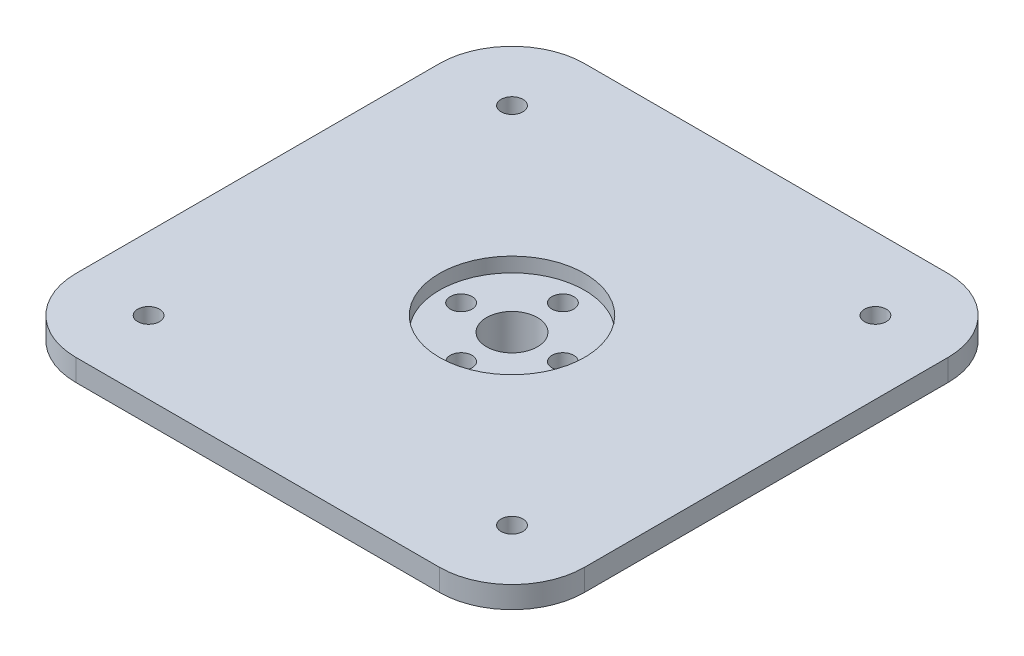
ISO-10303-21;
HEADER;
FILE_DESCRIPTION(('STEP AP214'),'2;1');
FILE_NAME('part.step','',(''),(''),'','','');
FILE_SCHEMA(('AUTOMOTIVE_DESIGN { 1 0 10303 214 1 1 1 1 }'));
ENDSEC;
DATA;
#1=APPLICATION_CONTEXT('core data for automotive mechanical design processes');
#2=APPLICATION_PROTOCOL_DEFINITION('international standard','automotive_design',2000,#1);
#3=PRODUCT_CONTEXT('',#1,'mechanical');
#4=PRODUCT('Part','Part','',(#3));
#5=PRODUCT_RELATED_PRODUCT_CATEGORY('part','',(#4));
#6=PRODUCT_DEFINITION_FORMATION('','',#4);
#7=PRODUCT_DEFINITION_CONTEXT('part definition',#1,'design');
#8=PRODUCT_DEFINITION('design','',#6,#7);
#9=PRODUCT_DEFINITION_SHAPE('','',#8);
#10=(LENGTH_UNIT() NAMED_UNIT(*) SI_UNIT(.MILLI.,.METRE.));
#11=(NAMED_UNIT(*) PLANE_ANGLE_UNIT() SI_UNIT($,.RADIAN.));
#12=(NAMED_UNIT(*) SI_UNIT($,.STERADIAN.) SOLID_ANGLE_UNIT());
#13=UNCERTAINTY_MEASURE_WITH_UNIT(LENGTH_MEASURE(1.E-05),#10,'distance_accuracy_value','');
#14=(GEOMETRIC_REPRESENTATION_CONTEXT(3) GLOBAL_UNCERTAINTY_ASSIGNED_CONTEXT((#13)) GLOBAL_UNIT_ASSIGNED_CONTEXT((#10,
#11,#12)) REPRESENTATION_CONTEXT('',''));
#15=CARTESIAN_POINT('',(0.,0.,0.));
#16=DIRECTION('',(0.,0.,1.));
#17=DIRECTION('',(1.,0.,0.));
#18=AXIS2_PLACEMENT_3D('',#15,#16,#17);
#19=CARTESIAN_POINT('',(0.,3.,-7.));
#20=DIRECTION('',(0.,-1.,0.));
#21=DIRECTION('',(0.,0.,-1.));
#22=AXIS2_PLACEMENT_3D('',#19,#20,#21);
#23=CYLINDRICAL_SURFACE('',#22,1.5);
#24=CARTESIAN_POINT('',(0.,-7.,-7.));
#25=DIRECTION('',(0.,-1.,0.));
#26=DIRECTION('',(0.,0.,-1.));
#27=AXIS2_PLACEMENT_3D('',#24,#25,#26);
#28=CIRCLE('',#27,1.5);
#29=CARTESIAN_POINT('',(0.,-7.,-8.5));
#30=VERTEX_POINT('',#29);
#31=EDGE_CURVE('E222',#30,#30,#28,.F.);
#32=ORIENTED_EDGE('',*,*,#31,.F.);
#33=EDGE_LOOP('',(#32));
#34=FACE_BOUND('',#33,.T.);
#35=CARTESIAN_POINT('',(0.,1.,-7.));
#36=DIRECTION('',(0.,1.,0.));
#37=DIRECTION('',(0.,0.,1.));
#38=AXIS2_PLACEMENT_3D('',#35,#36,#37);
#39=CIRCLE('',#38,1.5);
#40=CARTESIAN_POINT('',(0.,1.,-5.5));
#41=VERTEX_POINT('',#40);
#42=EDGE_CURVE('E245',#41,#41,#39,.T.);
#43=ORIENTED_EDGE('',*,*,#42,.T.);
#44=EDGE_LOOP('',(#43));
#45=FACE_BOUND('',#44,.T.);
#46=ADVANCED_FACE('F45',(#34,#45),#23,.F.);
#47=CARTESIAN_POINT('',(7.,3.,0.));
#48=DIRECTION('',(0.,-1.,0.));
#49=DIRECTION('',(0.,0.,-1.));
#50=AXIS2_PLACEMENT_3D('',#47,#48,#49);
#51=CYLINDRICAL_SURFACE('',#50,1.5);
#52=CARTESIAN_POINT('',(7.,-7.,0.));
#53=DIRECTION('',(0.,-1.,0.));
#54=DIRECTION('',(0.,0.,-1.));
#55=AXIS2_PLACEMENT_3D('',#52,#53,#54);
#56=CIRCLE('',#55,1.5);
#57=CARTESIAN_POINT('',(7.,-7.,-1.5));
#58=VERTEX_POINT('',#57);
#59=EDGE_CURVE('E217',#58,#58,#56,.F.);
#60=ORIENTED_EDGE('',*,*,#59,.F.);
#61=EDGE_LOOP('',(#60));
#62=FACE_BOUND('',#61,.T.);
#63=CARTESIAN_POINT('',(7.,1.,0.));
#64=DIRECTION('',(0.,1.,0.));
#65=DIRECTION('',(0.,0.,1.));
#66=AXIS2_PLACEMENT_3D('',#63,#64,#65);
#67=CIRCLE('',#66,1.5);
#68=CARTESIAN_POINT('',(7.,1.,1.5));
#69=VERTEX_POINT('',#68);
#70=EDGE_CURVE('E250',#69,#69,#67,.T.);
#71=ORIENTED_EDGE('',*,*,#70,.T.);
#72=EDGE_LOOP('',(#71));
#73=FACE_BOUND('',#72,.T.);
#74=ADVANCED_FACE('F284',(#62,#73),#51,.F.);
#75=CARTESIAN_POINT('',(0.,3.,0.));
#76=DIRECTION('',(0.,-1.,0.));
#77=DIRECTION('',(0.,0.,-1.));
#78=AXIS2_PLACEMENT_3D('',#75,#76,#77);
#79=CYLINDRICAL_SURFACE('',#78,3.5);
#80=CARTESIAN_POINT('',(0.,-7.,0.));
#81=DIRECTION('',(0.,-1.,0.));
#82=DIRECTION('',(0.,0.,-1.));
#83=AXIS2_PLACEMENT_3D('',#80,#81,#82);
#84=CIRCLE('',#83,3.5);
#85=CARTESIAN_POINT('',(0.,-7.,-3.50000000000001));
#86=VERTEX_POINT('',#85);
#87=EDGE_CURVE('E228',#86,#86,#84,.F.);
#88=ORIENTED_EDGE('',*,*,#87,.F.);
#89=EDGE_LOOP('',(#88));
#90=FACE_BOUND('',#89,.T.);
#91=CARTESIAN_POINT('',(0.,1.,0.));
#92=DIRECTION('',(0.,1.,0.));
#93=DIRECTION('',(0.,0.,1.));
#94=AXIS2_PLACEMENT_3D('',#91,#92,#93);
#95=CIRCLE('',#94,3.5);
#96=CARTESIAN_POINT('',(0.,1.,3.5));
#97=VERTEX_POINT('',#96);
#98=EDGE_CURVE('E253',#97,#97,#95,.T.);
#99=ORIENTED_EDGE('',*,*,#98,.T.);
#100=EDGE_LOOP('',(#99));
#101=FACE_BOUND('',#100,.T.);
#102=ADVANCED_FACE('F291',(#90,#101),#79,.F.);
#103=CARTESIAN_POINT('',(0.,3.,7.));
#104=DIRECTION('',(0.,-1.,0.));
#105=DIRECTION('',(0.,0.,-1.));
#106=AXIS2_PLACEMENT_3D('',#103,#104,#105);
#107=CYLINDRICAL_SURFACE('',#106,1.5);
#108=CARTESIAN_POINT('',(0.,-7.,7.));
#109=DIRECTION('',(0.,-1.,0.));
#110=DIRECTION('',(0.,0.,-1.));
#111=AXIS2_PLACEMENT_3D('',#108,#109,#110);
#112=CIRCLE('',#111,1.5);
#113=CARTESIAN_POINT('',(0.,-7.,5.5));
#114=VERTEX_POINT('',#113);
#115=EDGE_CURVE('E231',#114,#114,#112,.F.);
#116=ORIENTED_EDGE('',*,*,#115,.F.);
#117=EDGE_LOOP('',(#116));
#118=FACE_BOUND('',#117,.T.);
#119=CARTESIAN_POINT('',(0.,1.,7.));
#120=DIRECTION('',(0.,1.,0.));
#121=DIRECTION('',(0.,0.,1.));
#122=AXIS2_PLACEMENT_3D('',#119,#120,#121);
#123=CIRCLE('',#122,1.5);
#124=CARTESIAN_POINT('',(0.,1.,8.5));
#125=VERTEX_POINT('',#124);
#126=EDGE_CURVE('E256',#125,#125,#123,.T.);
#127=ORIENTED_EDGE('',*,*,#126,.T.);
#128=EDGE_LOOP('',(#127));
#129=FACE_BOUND('',#128,.T.);
#130=ADVANCED_FACE('F364',(#118,#129),#107,.F.);
#131=CARTESIAN_POINT('',(-7.,3.,0.));
#132=DIRECTION('',(0.,-1.,0.));
#133=DIRECTION('',(0.,0.,-1.));
#134=AXIS2_PLACEMENT_3D('',#131,#132,#133);
#135=CYLINDRICAL_SURFACE('',#134,1.5);
#136=CARTESIAN_POINT('',(-7.,-7.,0.));
#137=DIRECTION('',(0.,-1.,0.));
#138=DIRECTION('',(0.,0.,-1.));
#139=AXIS2_PLACEMENT_3D('',#136,#137,#138);
#140=CIRCLE('',#139,1.5);
#141=CARTESIAN_POINT('',(-7.,-7.,-1.5));
#142=VERTEX_POINT('',#141);
#143=EDGE_CURVE('E225',#142,#142,#140,.F.);
#144=ORIENTED_EDGE('',*,*,#143,.F.);
#145=EDGE_LOOP('',(#144));
#146=FACE_BOUND('',#145,.T.);
#147=CARTESIAN_POINT('',(-7.,1.,0.));
#148=DIRECTION('',(0.,1.,0.));
#149=DIRECTION('',(0.,0.,1.));
#150=AXIS2_PLACEMENT_3D('',#147,#148,#149);
#151=CIRCLE('',#150,1.5);
#152=CARTESIAN_POINT('',(-7.,1.,1.5));
#153=VERTEX_POINT('',#152);
#154=EDGE_CURVE('E49',#153,#153,#151,.T.);
#155=ORIENTED_EDGE('',*,*,#154,.T.);
#156=EDGE_LOOP('',(#155));
#157=FACE_BOUND('',#156,.T.);
#158=ADVANCED_FACE('F269',(#146,#157),#135,.F.);
#159=CARTESIAN_POINT('',(0.,0.,0.));
#160=DIRECTION('',(0.,-1.,0.));
#161=DIRECTION('',(0.,0.,-1.));
#162=AXIS2_PLACEMENT_3D('',#159,#160,#161);
#163=PLANE('',#162);
#164=CARTESIAN_POINT('',(0.,0.,0.));
#165=DIRECTION('',(0.,-1.,0.));
#166=DIRECTION('',(0.,0.,-1.));
#167=AXIS2_PLACEMENT_3D('',#164,#165,#166);
#168=CIRCLE('',#167,32.);
#169=CARTESIAN_POINT('',(0.,0.,-32.));
#170=VERTEX_POINT('',#169);
#171=EDGE_CURVE('E242',#170,#170,#168,.T.);
#172=ORIENTED_EDGE('',*,*,#171,.F.);
#173=EDGE_LOOP('',(#172));
#174=FACE_BOUND('',#173,.T.);
#175=CARTESIAN_POINT('',(-25.,0.,-25.));
#176=DIRECTION('',(0.,1.,0.));
#177=DIRECTION('',(0.,0.,-1.));
#178=AXIS2_PLACEMENT_3D('',#175,#176,#177);
#179=CIRCLE('',#178,1.5);
#180=CARTESIAN_POINT('',(-25.,0.,-26.5));
#181=VERTEX_POINT('',#180);
#182=EDGE_CURVE('E214',#181,#181,#179,.T.);
#183=ORIENTED_EDGE('',*,*,#182,.T.);
#184=EDGE_LOOP('',(#183));
#185=FACE_BOUND('',#184,.T.);
#186=CARTESIAN_POINT('',(25.,0.,25.));
#187=DIRECTION('',(0.,1.,0.));
#188=DIRECTION('',(0.,0.,1.));
#189=AXIS2_PLACEMENT_3D('',#186,#187,#188);
#190=CIRCLE('',#189,1.5);
#191=CARTESIAN_POINT('',(25.,0.,26.5));
#192=VERTEX_POINT('',#191);
#193=EDGE_CURVE('E202',#192,#192,#190,.T.);
#194=ORIENTED_EDGE('',*,*,#193,.T.);
#195=EDGE_LOOP('',(#194));
#196=FACE_BOUND('',#195,.T.);
#197=DIRECTION('',(-1.,0.,0.));
#198=VECTOR('',#197,1.);
#199=CARTESIAN_POINT('',(-35.,0.,-35.));
#200=LINE('',#199,#198);
#201=CARTESIAN_POINT('',(25.,0.,-35.));
#202=VERTEX_POINT('',#201);
#203=CARTESIAN_POINT('',(-25.,0.,-35.));
#204=VERTEX_POINT('',#203);
#205=EDGE_CURVE('E129',#202,#204,#200,.T.);
#206=ORIENTED_EDGE('',*,*,#205,.F.);
#207=CARTESIAN_POINT('',(25.,0.,-25.));
#208=DIRECTION('',(0.,-1.,0.));
#209=DIRECTION('',(0.,0.,-1.));
#210=AXIS2_PLACEMENT_3D('',#207,#208,#209);
#211=CIRCLE('',#210,10.);
#212=CARTESIAN_POINT('',(35.,0.,-25.));
#213=VERTEX_POINT('',#212);
#214=EDGE_CURVE('E112',#202,#213,#211,.T.);
#215=ORIENTED_EDGE('',*,*,#214,.T.);
#216=DIRECTION('',(0.,0.,-1.));
#217=VECTOR('',#216,1.);
#218=CARTESIAN_POINT('',(35.,0.,35.));
#219=LINE('',#218,#217);
#220=CARTESIAN_POINT('',(35.,0.,25.));
#221=VERTEX_POINT('',#220);
#222=EDGE_CURVE('E140',#221,#213,#219,.T.);
#223=ORIENTED_EDGE('',*,*,#222,.F.);
#224=CARTESIAN_POINT('',(25.,0.,25.));
#225=DIRECTION('',(0.,-1.,0.));
#226=DIRECTION('',(0.,0.,-1.));
#227=AXIS2_PLACEMENT_3D('',#224,#225,#226);
#228=CIRCLE('',#227,10.);
#229=CARTESIAN_POINT('',(25.,0.,35.));
#230=VERTEX_POINT('',#229);
#231=EDGE_CURVE('E123',#221,#230,#228,.T.);
#232=ORIENTED_EDGE('',*,*,#231,.T.);
#233=DIRECTION('',(1.,0.,0.));
#234=VECTOR('',#233,1.);
#235=CARTESIAN_POINT('',(-35.,0.,35.));
#236=LINE('',#235,#234);
#237=CARTESIAN_POINT('',(-25.,0.,35.));
#238=VERTEX_POINT('',#237);
#239=EDGE_CURVE('E143',#238,#230,#236,.T.);
#240=ORIENTED_EDGE('',*,*,#239,.F.);
#241=CARTESIAN_POINT('',(-25.,0.,25.));
#242=DIRECTION('',(0.,-1.,0.));
#243=DIRECTION('',(0.,0.,-1.));
#244=AXIS2_PLACEMENT_3D('',#241,#242,#243);
#245=CIRCLE('',#244,10.);
#246=CARTESIAN_POINT('',(-35.,0.,25.));
#247=VERTEX_POINT('',#246);
#248=EDGE_CURVE('E159',#238,#247,#245,.T.);
#249=ORIENTED_EDGE('',*,*,#248,.T.);
#250=DIRECTION('',(0.,0.,1.));
#251=VECTOR('',#250,1.);
#252=CARTESIAN_POINT('',(-35.,0.,35.));
#253=LINE('',#252,#251);
#254=CARTESIAN_POINT('',(-35.,0.,-25.));
#255=VERTEX_POINT('',#254);
#256=EDGE_CURVE('E139',#255,#247,#253,.T.);
#257=ORIENTED_EDGE('',*,*,#256,.F.);
#258=CARTESIAN_POINT('',(-25.,0.,-25.));
#259=DIRECTION('',(0.,-1.,0.));
#260=DIRECTION('',(0.,0.,-1.));
#261=AXIS2_PLACEMENT_3D('',#258,#259,#260);
#262=CIRCLE('',#261,10.);
#263=EDGE_CURVE('E133',#255,#204,#262,.T.);
#264=ORIENTED_EDGE('',*,*,#263,.T.);
#265=EDGE_LOOP('',(#206,#215,#223,#232,#240,#249,#257,#264));
#266=FACE_BOUND('',#265,.T.);
#267=CARTESIAN_POINT('',(25.,0.,-25.));
#268=DIRECTION('',(0.,1.,0.));
#269=DIRECTION('',(0.,0.,1.));
#270=AXIS2_PLACEMENT_3D('',#267,#268,#269);
#271=CIRCLE('',#270,1.5);
#272=CARTESIAN_POINT('',(25.,0.,-23.5));
#273=VERTEX_POINT('',#272);
#274=EDGE_CURVE('E196',#273,#273,#271,.T.);
#275=ORIENTED_EDGE('',*,*,#274,.T.);
#276=EDGE_LOOP('',(#275));
#277=FACE_BOUND('',#276,.T.);
#278=CARTESIAN_POINT('',(-25.,0.,25.));
#279=DIRECTION('',(0.,1.,0.));
#280=DIRECTION('',(0.,0.,-1.));
#281=AXIS2_PLACEMENT_3D('',#278,#279,#280);
#282=CIRCLE('',#281,1.5);
#283=CARTESIAN_POINT('',(-25.,0.,23.5));
#284=VERTEX_POINT('',#283);
#285=EDGE_CURVE('E208',#284,#284,#282,.T.);
#286=ORIENTED_EDGE('',*,*,#285,.T.);
#287=EDGE_LOOP('',(#286));
#288=FACE_BOUND('',#287,.T.);
#289=ADVANCED_FACE('F136',(#174,#185,#196,#266,#277,#288),#163,.T.);
#290=CARTESIAN_POINT('',(0.,3.,0.));
#291=DIRECTION('',(0.,-1.,0.));
#292=DIRECTION('',(0.,0.,-1.));
#293=AXIS2_PLACEMENT_3D('',#290,#291,#292);
#294=PLANE('',#293);
#295=CARTESIAN_POINT('',(0.,3.,0.));
#296=DIRECTION('',(0.,1.,0.));
#297=DIRECTION('',(0.,0.,1.));
#298=AXIS2_PLACEMENT_3D('',#295,#296,#297);
#299=CIRCLE('',#298,10.);
#300=CARTESIAN_POINT('',(0.,3.,10.));
#301=VERTEX_POINT('',#300);
#302=EDGE_CURVE('E259',#301,#301,#299,.T.);
#303=ORIENTED_EDGE('',*,*,#302,.F.);
#304=EDGE_LOOP('',(#303));
#305=FACE_BOUND('',#304,.T.);
#306=DIRECTION('',(0.,0.,-1.));
#307=VECTOR('',#306,1.);
#308=CARTESIAN_POINT('',(35.,3.,35.));
#309=LINE('',#308,#307);
#310=CARTESIAN_POINT('',(35.,3.,25.));
#311=VERTEX_POINT('',#310);
#312=CARTESIAN_POINT('',(35.,3.,-25.));
#313=VERTEX_POINT('',#312);
#314=EDGE_CURVE('E150',#311,#313,#309,.T.);
#315=ORIENTED_EDGE('',*,*,#314,.T.);
#316=CARTESIAN_POINT('',(25.,3.,-25.));
#317=DIRECTION('',(0.,-1.,0.));
#318=DIRECTION('',(0.,0.,-1.));
#319=AXIS2_PLACEMENT_3D('',#316,#317,#318);
#320=CIRCLE('',#319,10.);
#321=CARTESIAN_POINT('',(25.,3.,-35.));
#322=VERTEX_POINT('',#321);
#323=EDGE_CURVE('E170',#313,#322,#320,.F.);
#324=ORIENTED_EDGE('',*,*,#323,.T.);
#325=DIRECTION('',(-1.,0.,0.));
#326=VECTOR('',#325,1.);
#327=CARTESIAN_POINT('',(-35.,3.,-35.));
#328=LINE('',#327,#326);
#329=CARTESIAN_POINT('',(-25.,3.,-35.));
#330=VERTEX_POINT('',#329);
#331=EDGE_CURVE('E132',#322,#330,#328,.T.);
#332=ORIENTED_EDGE('',*,*,#331,.T.);
#333=CARTESIAN_POINT('',(-25.,3.,-25.));
#334=DIRECTION('',(0.,-1.,0.));
#335=DIRECTION('',(0.,0.,-1.));
#336=AXIS2_PLACEMENT_3D('',#333,#334,#335);
#337=CIRCLE('',#336,10.);
#338=CARTESIAN_POINT('',(-35.,3.,-25.));
#339=VERTEX_POINT('',#338);
#340=EDGE_CURVE('E165',#330,#339,#337,.F.);
#341=ORIENTED_EDGE('',*,*,#340,.T.);
#342=DIRECTION('',(0.,0.,1.));
#343=VECTOR('',#342,1.);
#344=CARTESIAN_POINT('',(-35.,3.,35.));
#345=LINE('',#344,#343);
#346=CARTESIAN_POINT('',(-35.,3.,25.));
#347=VERTEX_POINT('',#346);
#348=EDGE_CURVE('E182',#339,#347,#345,.T.);
#349=ORIENTED_EDGE('',*,*,#348,.T.);
#350=CARTESIAN_POINT('',(-25.,3.,25.));
#351=DIRECTION('',(0.,-1.,0.));
#352=DIRECTION('',(0.,0.,-1.));
#353=AXIS2_PLACEMENT_3D('',#350,#351,#352);
#354=CIRCLE('',#353,10.);
#355=CARTESIAN_POINT('',(-25.,3.,35.));
#356=VERTEX_POINT('',#355);
#357=EDGE_CURVE('E68',#347,#356,#354,.F.);
#358=ORIENTED_EDGE('',*,*,#357,.T.);
#359=DIRECTION('',(1.,0.,0.));
#360=VECTOR('',#359,1.);
#361=CARTESIAN_POINT('',(-35.,3.,35.));
#362=LINE('',#361,#360);
#363=CARTESIAN_POINT('',(25.,3.,35.));
#364=VERTEX_POINT('',#363);
#365=EDGE_CURVE('E156',#356,#364,#362,.T.);
#366=ORIENTED_EDGE('',*,*,#365,.T.);
#367=CARTESIAN_POINT('',(25.,3.,25.));
#368=DIRECTION('',(0.,-1.,0.));
#369=DIRECTION('',(0.,0.,-1.));
#370=AXIS2_PLACEMENT_3D('',#367,#368,#369);
#371=CIRCLE('',#370,10.);
#372=EDGE_CURVE('E168',#364,#311,#371,.F.);
#373=ORIENTED_EDGE('',*,*,#372,.T.);
#374=EDGE_LOOP('',(#315,#324,#332,#341,#349,#358,#366,#373));
#375=FACE_BOUND('',#374,.T.);
#376=CARTESIAN_POINT('',(25.,3.,-25.));
#377=DIRECTION('',(0.,1.,0.));
#378=DIRECTION('',(0.,0.,1.));
#379=AXIS2_PLACEMENT_3D('',#376,#377,#378);
#380=CIRCLE('',#379,1.5);
#381=CARTESIAN_POINT('',(25.,3.,-23.5));
#382=VERTEX_POINT('',#381);
#383=EDGE_CURVE('E145',#382,#382,#380,.T.);
#384=ORIENTED_EDGE('',*,*,#383,.F.);
#385=EDGE_LOOP('',(#384));
#386=FACE_BOUND('',#385,.T.);
#387=CARTESIAN_POINT('',(25.,3.,25.));
#388=DIRECTION('',(0.,1.,0.));
#389=DIRECTION('',(0.,0.,1.));
#390=AXIS2_PLACEMENT_3D('',#387,#388,#389);
#391=CIRCLE('',#390,1.5);
#392=CARTESIAN_POINT('',(25.,3.,26.5));
#393=VERTEX_POINT('',#392);
#394=EDGE_CURVE('E199',#393,#393,#391,.T.);
#395=ORIENTED_EDGE('',*,*,#394,.F.);
#396=EDGE_LOOP('',(#395));
#397=FACE_BOUND('',#396,.T.);
#398=CARTESIAN_POINT('',(-25.,3.,25.));
#399=DIRECTION('',(0.,1.,0.));
#400=DIRECTION('',(0.,0.,-1.));
#401=AXIS2_PLACEMENT_3D('',#398,#399,#400);
#402=CIRCLE('',#401,1.5);
#403=CARTESIAN_POINT('',(-25.,3.,23.5));
#404=VERTEX_POINT('',#403);
#405=EDGE_CURVE('E205',#404,#404,#402,.T.);
#406=ORIENTED_EDGE('',*,*,#405,.F.);
#407=EDGE_LOOP('',(#406));
#408=FACE_BOUND('',#407,.T.);
#409=CARTESIAN_POINT('',(-25.,3.,-25.));
#410=DIRECTION('',(0.,1.,0.));
#411=DIRECTION('',(0.,0.,-1.));
#412=AXIS2_PLACEMENT_3D('',#409,#410,#411);
#413=CIRCLE('',#412,1.5);
#414=CARTESIAN_POINT('',(-25.,3.,-26.5));
#415=VERTEX_POINT('',#414);
#416=EDGE_CURVE('E211',#415,#415,#413,.T.);
#417=ORIENTED_EDGE('',*,*,#416,.F.);
#418=EDGE_LOOP('',(#417));
#419=FACE_BOUND('',#418,.T.);
#420=ADVANCED_FACE('F298',(#305,#375,#386,#397,#408,#419),#294,.F.);
#421=CARTESIAN_POINT('',(35.,3.,35.));
#422=DIRECTION('',(-1.,0.,0.));
#423=DIRECTION('',(0.,0.,1.));
#424=AXIS2_PLACEMENT_3D('',#421,#422,#423);
#425=PLANE('',#424);
#426=ORIENTED_EDGE('',*,*,#222,.T.);
#427=DIRECTION('',(0.,-1.,0.));
#428=VECTOR('',#427,1.);
#429=CARTESIAN_POINT('',(35.,3.,-25.));
#430=LINE('',#429,#428);
#431=EDGE_CURVE('E117',#213,#313,#430,.F.);
#432=ORIENTED_EDGE('',*,*,#431,.T.);
#433=ORIENTED_EDGE('',*,*,#314,.F.);
#434=DIRECTION('',(0.,-1.,0.));
#435=VECTOR('',#434,1.);
#436=CARTESIAN_POINT('',(35.,3.,25.));
#437=LINE('',#436,#435);
#438=EDGE_CURVE('E122',#311,#221,#437,.T.);
#439=ORIENTED_EDGE('',*,*,#438,.T.);
#440=EDGE_LOOP('',(#426,#432,#433,#439));
#441=FACE_BOUND('',#440,.T.);
#442=ADVANCED_FACE('F301',(#441),#425,.F.);
#443=CARTESIAN_POINT('',(-35.,3.,-35.));
#444=DIRECTION('',(0.,0.,1.));
#445=DIRECTION('',(1.,0.,0.));
#446=AXIS2_PLACEMENT_3D('',#443,#444,#445);
#447=PLANE('',#446);
#448=ORIENTED_EDGE('',*,*,#331,.F.);
#449=DIRECTION('',(0.,-1.,0.));
#450=VECTOR('',#449,1.);
#451=CARTESIAN_POINT('',(25.,3.,-35.));
#452=LINE('',#451,#450);
#453=EDGE_CURVE('E116',#322,#202,#452,.T.);
#454=ORIENTED_EDGE('',*,*,#453,.T.);
#455=ORIENTED_EDGE('',*,*,#205,.T.);
#456=DIRECTION('',(0.,-1.,0.));
#457=VECTOR('',#456,1.);
#458=CARTESIAN_POINT('',(-25.,3.,-35.));
#459=LINE('',#458,#457);
#460=EDGE_CURVE('E134',#204,#330,#459,.F.);
#461=ORIENTED_EDGE('',*,*,#460,.T.);
#462=EDGE_LOOP('',(#448,#454,#455,#461));
#463=FACE_BOUND('',#462,.T.);
#464=ADVANCED_FACE('F128',(#463),#447,.F.);
#465=CARTESIAN_POINT('',(-35.,3.,35.));
#466=DIRECTION('',(1.,0.,0.));
#467=DIRECTION('',(0.,0.,-1.));
#468=AXIS2_PLACEMENT_3D('',#465,#466,#467);
#469=PLANE('',#468);
#470=ORIENTED_EDGE('',*,*,#256,.T.);
#471=DIRECTION('',(0.,-1.,0.));
#472=VECTOR('',#471,1.);
#473=CARTESIAN_POINT('',(-35.,3.,25.));
#474=LINE('',#473,#472);
#475=EDGE_CURVE('E11',#247,#347,#474,.F.);
#476=ORIENTED_EDGE('',*,*,#475,.T.);
#477=ORIENTED_EDGE('',*,*,#348,.F.);
#478=DIRECTION('',(0.,-1.,0.));
#479=VECTOR('',#478,1.);
#480=CARTESIAN_POINT('',(-35.,3.,-25.));
#481=LINE('',#480,#479);
#482=EDGE_CURVE('E54',#339,#255,#481,.T.);
#483=ORIENTED_EDGE('',*,*,#482,.T.);
#484=EDGE_LOOP('',(#470,#476,#477,#483));
#485=FACE_BOUND('',#484,.T.);
#486=ADVANCED_FACE('F180',(#485),#469,.F.);
#487=CARTESIAN_POINT('',(-35.,3.,35.));
#488=DIRECTION('',(0.,0.,-1.));
#489=DIRECTION('',(-1.,0.,0.));
#490=AXIS2_PLACEMENT_3D('',#487,#488,#489);
#491=PLANE('',#490);
#492=ORIENTED_EDGE('',*,*,#239,.T.);
#493=DIRECTION('',(0.,-1.,0.));
#494=VECTOR('',#493,1.);
#495=CARTESIAN_POINT('',(25.,3.,35.));
#496=LINE('',#495,#494);
#497=EDGE_CURVE('E61',#230,#364,#496,.F.);
#498=ORIENTED_EDGE('',*,*,#497,.T.);
#499=ORIENTED_EDGE('',*,*,#365,.F.);
#500=DIRECTION('',(0.,-1.,0.));
#501=VECTOR('',#500,1.);
#502=CARTESIAN_POINT('',(-25.,3.,35.));
#503=LINE('',#502,#501);
#504=EDGE_CURVE('E172',#356,#238,#503,.T.);
#505=ORIENTED_EDGE('',*,*,#504,.T.);
#506=EDGE_LOOP('',(#492,#498,#499,#505));
#507=FACE_BOUND('',#506,.T.);
#508=ADVANCED_FACE('F189',(#507),#491,.F.);
#509=CARTESIAN_POINT('',(25.,3.,-25.));
#510=DIRECTION('',(0.,-1.,0.));
#511=DIRECTION('',(0.,0.,-1.));
#512=AXIS2_PLACEMENT_3D('',#509,#510,#511);
#513=CYLINDRICAL_SURFACE('',#512,1.5);
#514=ORIENTED_EDGE('',*,*,#383,.T.);
#515=EDGE_LOOP('',(#514));
#516=FACE_BOUND('',#515,.T.);
#517=ORIENTED_EDGE('',*,*,#274,.F.);
#518=EDGE_LOOP('',(#517));
#519=FACE_BOUND('',#518,.T.);
#520=ADVANCED_FACE('F308',(#516,#519),#513,.F.);
#521=CARTESIAN_POINT('',(25.,3.,25.));
#522=DIRECTION('',(0.,-1.,0.));
#523=DIRECTION('',(0.,0.,-1.));
#524=AXIS2_PLACEMENT_3D('',#521,#522,#523);
#525=CYLINDRICAL_SURFACE('',#524,1.5);
#526=ORIENTED_EDGE('',*,*,#394,.T.);
#527=EDGE_LOOP('',(#526));
#528=FACE_BOUND('',#527,.T.);
#529=ORIENTED_EDGE('',*,*,#193,.F.);
#530=EDGE_LOOP('',(#529));
#531=FACE_BOUND('',#530,.T.);
#532=ADVANCED_FACE('F349',(#528,#531),#525,.F.);
#533=CARTESIAN_POINT('',(-25.,3.,25.));
#534=DIRECTION('',(0.,-1.,0.));
#535=DIRECTION('',(0.,0.,-1.));
#536=AXIS2_PLACEMENT_3D('',#533,#534,#535);
#537=CYLINDRICAL_SURFACE('',#536,1.5);
#538=ORIENTED_EDGE('',*,*,#405,.T.);
#539=EDGE_LOOP('',(#538));
#540=FACE_BOUND('',#539,.T.);
#541=ORIENTED_EDGE('',*,*,#285,.F.);
#542=EDGE_LOOP('',(#541));
#543=FACE_BOUND('',#542,.T.);
#544=ADVANCED_FACE('F342',(#540,#543),#537,.F.);
#545=CARTESIAN_POINT('',(-25.,3.,-25.));
#546=DIRECTION('',(0.,-1.,0.));
#547=DIRECTION('',(0.,0.,-1.));
#548=AXIS2_PLACEMENT_3D('',#545,#546,#547);
#549=CYLINDRICAL_SURFACE('',#548,1.5);
#550=ORIENTED_EDGE('',*,*,#416,.T.);
#551=EDGE_LOOP('',(#550));
#552=FACE_BOUND('',#551,.T.);
#553=ORIENTED_EDGE('',*,*,#182,.F.);
#554=EDGE_LOOP('',(#553));
#555=FACE_BOUND('',#554,.T.);
#556=ADVANCED_FACE('F338',(#552,#555),#549,.F.);
#557=CARTESIAN_POINT('',(0.,-7.,0.));
#558=DIRECTION('',(0.,-1.,0.));
#559=DIRECTION('',(0.,0.,-1.));
#560=AXIS2_PLACEMENT_3D('',#557,#558,#559);
#561=PLANE('',#560);
#562=ORIENTED_EDGE('',*,*,#115,.T.);
#563=EDGE_LOOP('',(#562));
#564=FACE_BOUND('',#563,.T.);
#565=ORIENTED_EDGE('',*,*,#87,.T.);
#566=EDGE_LOOP('',(#565));
#567=FACE_BOUND('',#566,.T.);
#568=ORIENTED_EDGE('',*,*,#143,.T.);
#569=EDGE_LOOP('',(#568));
#570=FACE_BOUND('',#569,.T.);
#571=ORIENTED_EDGE('',*,*,#31,.T.);
#572=EDGE_LOOP('',(#571));
#573=FACE_BOUND('',#572,.T.);
#574=ORIENTED_EDGE('',*,*,#59,.T.);
#575=EDGE_LOOP('',(#574));
#576=FACE_BOUND('',#575,.T.);
#577=CARTESIAN_POINT('',(0.,-7.,0.));
#578=DIRECTION('',(0.,-1.,0.));
#579=DIRECTION('',(0.,0.,-1.));
#580=AXIS2_PLACEMENT_3D('',#577,#578,#579);
#581=CIRCLE('',#580,15.);
#582=CARTESIAN_POINT('',(0.,-7.,-15.));
#583=VERTEX_POINT('',#582);
#584=EDGE_CURVE('E234',#583,#583,#581,.F.);
#585=ORIENTED_EDGE('',*,*,#584,.F.);
#586=EDGE_LOOP('',(#585));
#587=FACE_BOUND('',#586,.T.);
#588=ADVANCED_FACE('F341',(#564,#567,#570,#573,#576,#587),#561,.T.);
#589=CARTESIAN_POINT('',(0.,-9.,0.));
#590=DIRECTION('',(0.,-1.,0.));
#591=DIRECTION('',(0.,0.,-1.));
#592=AXIS2_PLACEMENT_3D('',#589,#590,#591);
#593=PLANE('',#592);
#594=CARTESIAN_POINT('',(0.,-9.,0.));
#595=DIRECTION('',(0.,-1.,0.));
#596=DIRECTION('',(0.,0.,-1.));
#597=AXIS2_PLACEMENT_3D('',#594,#595,#596);
#598=CIRCLE('',#597,22.);
#599=CARTESIAN_POINT('',(0.,-9.,-22.));
#600=VERTEX_POINT('',#599);
#601=EDGE_CURVE('E237',#600,#600,#598,.T.);
#602=ORIENTED_EDGE('',*,*,#601,.T.);
#603=EDGE_LOOP('',(#602));
#604=FACE_BOUND('',#603,.T.);
#605=CARTESIAN_POINT('',(0.,-9.,0.));
#606=DIRECTION('',(0.,-1.,0.));
#607=DIRECTION('',(0.,0.,-1.));
#608=AXIS2_PLACEMENT_3D('',#605,#606,#607);
#609=CIRCLE('',#608,15.);
#610=CARTESIAN_POINT('',(0.,-9.,-15.));
#611=VERTEX_POINT('',#610);
#612=EDGE_CURVE('E154',#611,#611,#609,.T.);
#613=ORIENTED_EDGE('',*,*,#612,.F.);
#614=EDGE_LOOP('',(#613));
#615=FACE_BOUND('',#614,.T.);
#616=ADVANCED_FACE('F382',(#604,#615),#593,.T.);
#617=CARTESIAN_POINT('',(0.,-9.,0.));
#618=DIRECTION('',(0.,1.,0.));
#619=DIRECTION('',(0.,0.,1.));
#620=AXIS2_PLACEMENT_3D('',#617,#618,#619);
#621=CYLINDRICAL_SURFACE('',#620,22.);
#622=CARTESIAN_POINT('',(0.,-2.,0.));
#623=DIRECTION('',(0.,-1.,0.));
#624=DIRECTION('',(0.,0.,-1.));
#625=AXIS2_PLACEMENT_3D('',#622,#623,#624);
#626=CIRCLE('',#625,22.);
#627=CARTESIAN_POINT('',(0.,-2.,-22.));
#628=VERTEX_POINT('',#627);
#629=EDGE_CURVE('E151',#628,#628,#626,.T.);
#630=ORIENTED_EDGE('',*,*,#629,.T.);
#631=EDGE_LOOP('',(#630));
#632=FACE_BOUND('',#631,.T.);
#633=ORIENTED_EDGE('',*,*,#601,.F.);
#634=EDGE_LOOP('',(#633));
#635=FACE_BOUND('',#634,.T.);
#636=ADVANCED_FACE('F396',(#632,#635),#621,.T.);
#637=CARTESIAN_POINT('',(0.,-9.,0.));
#638=DIRECTION('',(0.,1.,0.));
#639=DIRECTION('',(0.,0.,1.));
#640=AXIS2_PLACEMENT_3D('',#637,#638,#639);
#641=CYLINDRICAL_SURFACE('',#640,15.);
#642=ORIENTED_EDGE('',*,*,#584,.T.);
#643=EDGE_LOOP('',(#642));
#644=FACE_BOUND('',#643,.T.);
#645=ORIENTED_EDGE('',*,*,#612,.T.);
#646=EDGE_LOOP('',(#645));
#647=FACE_BOUND('',#646,.T.);
#648=ADVANCED_FACE('F392',(#644,#647),#641,.F.);
#649=CARTESIAN_POINT('',(0.,-2.,0.));
#650=DIRECTION('',(0.,-1.,0.));
#651=DIRECTION('',(0.,0.,-1.));
#652=AXIS2_PLACEMENT_3D('',#649,#650,#651);
#653=PLANE('',#652);
#654=ORIENTED_EDGE('',*,*,#629,.F.);
#655=EDGE_LOOP('',(#654));
#656=FACE_BOUND('',#655,.T.);
#657=CARTESIAN_POINT('',(0.,-2.,0.));
#658=DIRECTION('',(0.,-1.,0.));
#659=DIRECTION('',(0.,0.,-1.));
#660=AXIS2_PLACEMENT_3D('',#657,#658,#659);
#661=CIRCLE('',#660,32.);
#662=CARTESIAN_POINT('',(0.,-2.,-32.));
#663=VERTEX_POINT('',#662);
#664=EDGE_CURVE('E155',#663,#663,#661,.T.);
#665=ORIENTED_EDGE('',*,*,#664,.T.);
#666=EDGE_LOOP('',(#665));
#667=FACE_BOUND('',#666,.T.);
#668=ADVANCED_FACE('F395',(#656,#667),#653,.T.);
#669=CARTESIAN_POINT('',(0.,-2.,0.));
#670=DIRECTION('',(0.,1.,0.));
#671=DIRECTION('',(0.,0.,1.));
#672=AXIS2_PLACEMENT_3D('',#669,#670,#671);
#673=CYLINDRICAL_SURFACE('',#672,32.);
#674=ORIENTED_EDGE('',*,*,#664,.F.);
#675=EDGE_LOOP('',(#674));
#676=FACE_BOUND('',#675,.T.);
#677=ORIENTED_EDGE('',*,*,#171,.T.);
#678=EDGE_LOOP('',(#677));
#679=FACE_BOUND('',#678,.T.);
#680=ADVANCED_FACE('F319',(#676,#679),#673,.T.);
#681=CARTESIAN_POINT('',(25.,3.,-25.));
#682=DIRECTION('',(0.,-1.,0.));
#683=DIRECTION('',(0.,0.,-1.));
#684=AXIS2_PLACEMENT_3D('',#681,#682,#683);
#685=CYLINDRICAL_SURFACE('',#684,10.);
#686=ORIENTED_EDGE('',*,*,#323,.F.);
#687=ORIENTED_EDGE('',*,*,#431,.F.);
#688=ORIENTED_EDGE('',*,*,#214,.F.);
#689=ORIENTED_EDGE('',*,*,#453,.F.);
#690=EDGE_LOOP('',(#686,#687,#688,#689));
#691=FACE_BOUND('',#690,.T.);
#692=ADVANCED_FACE('F115',(#691),#685,.T.);
#693=CARTESIAN_POINT('',(25.,3.,25.));
#694=DIRECTION('',(0.,-1.,0.));
#695=DIRECTION('',(0.,0.,-1.));
#696=AXIS2_PLACEMENT_3D('',#693,#694,#695);
#697=CYLINDRICAL_SURFACE('',#696,10.);
#698=ORIENTED_EDGE('',*,*,#372,.F.);
#699=ORIENTED_EDGE('',*,*,#497,.F.);
#700=ORIENTED_EDGE('',*,*,#231,.F.);
#701=ORIENTED_EDGE('',*,*,#438,.F.);
#702=EDGE_LOOP('',(#698,#699,#700,#701));
#703=FACE_BOUND('',#702,.T.);
#704=ADVANCED_FACE('F318',(#703),#697,.T.);
#705=CARTESIAN_POINT('',(-25.,3.,25.));
#706=DIRECTION('',(0.,-1.,0.));
#707=DIRECTION('',(0.,0.,-1.));
#708=AXIS2_PLACEMENT_3D('',#705,#706,#707);
#709=CYLINDRICAL_SURFACE('',#708,10.);
#710=ORIENTED_EDGE('',*,*,#357,.F.);
#711=ORIENTED_EDGE('',*,*,#475,.F.);
#712=ORIENTED_EDGE('',*,*,#248,.F.);
#713=ORIENTED_EDGE('',*,*,#504,.F.);
#714=EDGE_LOOP('',(#710,#711,#712,#713));
#715=FACE_BOUND('',#714,.T.);
#716=ADVANCED_FACE('F188',(#715),#709,.T.);
#717=CARTESIAN_POINT('',(-25.,3.,-25.));
#718=DIRECTION('',(0.,-1.,0.));
#719=DIRECTION('',(0.,0.,-1.));
#720=AXIS2_PLACEMENT_3D('',#717,#718,#719);
#721=CYLINDRICAL_SURFACE('',#720,10.);
#722=ORIENTED_EDGE('',*,*,#340,.F.);
#723=ORIENTED_EDGE('',*,*,#460,.F.);
#724=ORIENTED_EDGE('',*,*,#263,.F.);
#725=ORIENTED_EDGE('',*,*,#482,.F.);
#726=EDGE_LOOP('',(#722,#723,#724,#725));
#727=FACE_BOUND('',#726,.T.);
#728=ADVANCED_FACE('F47',(#727),#721,.T.);
#729=CARTESIAN_POINT('',(0.,1.,0.));
#730=DIRECTION('',(0.,1.,0.));
#731=DIRECTION('',(0.,0.,1.));
#732=AXIS2_PLACEMENT_3D('',#729,#730,#731);
#733=CYLINDRICAL_SURFACE('',#732,10.);
#734=CARTESIAN_POINT('',(0.,1.,0.));
#735=DIRECTION('',(0.,1.,0.));
#736=DIRECTION('',(0.,0.,1.));
#737=AXIS2_PLACEMENT_3D('',#734,#735,#736);
#738=CIRCLE('',#737,10.);
#739=CARTESIAN_POINT('',(0.,1.,10.));
#740=VERTEX_POINT('',#739);
#741=EDGE_CURVE('E262',#740,#740,#738,.T.);
#742=ORIENTED_EDGE('',*,*,#741,.F.);
#743=EDGE_LOOP('',(#742));
#744=FACE_BOUND('',#743,.T.);
#745=ORIENTED_EDGE('',*,*,#302,.T.);
#746=EDGE_LOOP('',(#745));
#747=FACE_BOUND('',#746,.T.);
#748=ADVANCED_FACE('F273',(#744,#747),#733,.F.);
#749=CARTESIAN_POINT('',(0.,1.,0.));
#750=DIRECTION('',(0.,1.,0.));
#751=DIRECTION('',(0.,0.,1.));
#752=AXIS2_PLACEMENT_3D('',#749,#750,#751);
#753=PLANE('',#752);
#754=ORIENTED_EDGE('',*,*,#42,.F.);
#755=EDGE_LOOP('',(#754));
#756=FACE_BOUND('',#755,.T.);
#757=ORIENTED_EDGE('',*,*,#70,.F.);
#758=EDGE_LOOP('',(#757));
#759=FACE_BOUND('',#758,.T.);
#760=ORIENTED_EDGE('',*,*,#98,.F.);
#761=EDGE_LOOP('',(#760));
#762=FACE_BOUND('',#761,.T.);
#763=ORIENTED_EDGE('',*,*,#126,.F.);
#764=EDGE_LOOP('',(#763));
#765=FACE_BOUND('',#764,.T.);
#766=ORIENTED_EDGE('',*,*,#154,.F.);
#767=EDGE_LOOP('',(#766));
#768=FACE_BOUND('',#767,.T.);
#769=ORIENTED_EDGE('',*,*,#741,.T.);
#770=EDGE_LOOP('',(#769));
#771=FACE_BOUND('',#770,.T.);
#772=ADVANCED_FACE('F271',(#756,#759,#762,#765,#768,#771),#753,.T.);
#773=CLOSED_SHELL('',(#46,#74,#102,#130,#158,#289,#420,#442,#464,#486,#508,#520,#532,#544,#556,
#588,#616,#636,#648,#668,#680,#692,#704,#716,#728,#748,#772));
#774=MANIFOLD_SOLID_BREP('B2',#773);
#775=ADVANCED_BREP_SHAPE_REPRESENTATION('',(#18,#774),#14);
#776=SHAPE_DEFINITION_REPRESENTATION(#9,#775);
ENDSEC;
END-ISO-10303-21;
